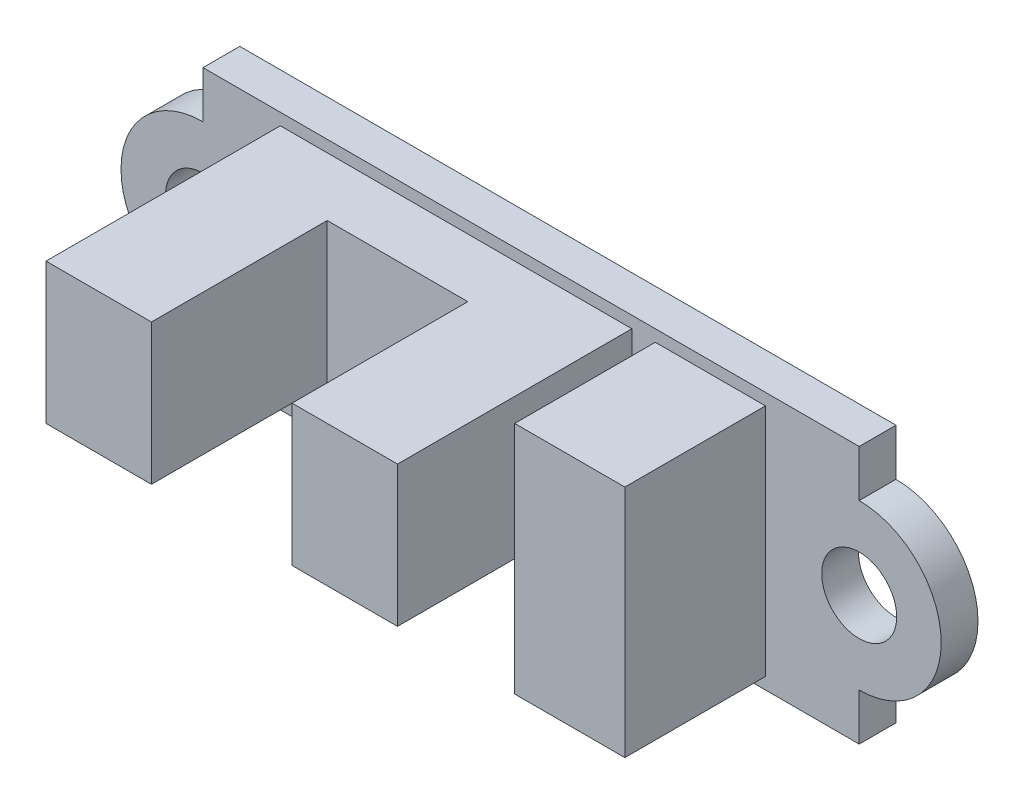
ISO-10303-21;
HEADER;
FILE_DESCRIPTION(('STEP AP214'),'2;1');
FILE_NAME('part.step','',(''),(''),'','','');
FILE_SCHEMA(('AUTOMOTIVE_DESIGN { 1 0 10303 214 1 1 1 1 }'));
ENDSEC;
DATA;
#1=APPLICATION_CONTEXT('core data for automotive mechanical design processes');
#2=APPLICATION_PROTOCOL_DEFINITION('international standard','automotive_design',2000,#1);
#3=PRODUCT_CONTEXT('',#1,'mechanical');
#4=PRODUCT('Part','Part','',(#3));
#5=PRODUCT_RELATED_PRODUCT_CATEGORY('part','',(#4));
#6=PRODUCT_DEFINITION_FORMATION('','',#4);
#7=PRODUCT_DEFINITION_CONTEXT('part definition',#1,'design');
#8=PRODUCT_DEFINITION('design','',#6,#7);
#9=PRODUCT_DEFINITION_SHAPE('','',#8);
#10=(LENGTH_UNIT() NAMED_UNIT(*) SI_UNIT(.MILLI.,.METRE.));
#11=(NAMED_UNIT(*) PLANE_ANGLE_UNIT() SI_UNIT($,.RADIAN.));
#12=(NAMED_UNIT(*) SI_UNIT($,.STERADIAN.) SOLID_ANGLE_UNIT());
#13=UNCERTAINTY_MEASURE_WITH_UNIT(LENGTH_MEASURE(1.E-05),#10,'distance_accuracy_value','');
#14=(GEOMETRIC_REPRESENTATION_CONTEXT(3) GLOBAL_UNCERTAINTY_ASSIGNED_CONTEXT((#13)) GLOBAL_UNIT_ASSIGNED_CONTEXT((#10,
#11,#12)) REPRESENTATION_CONTEXT('',''));
#15=CARTESIAN_POINT('',(0.,0.,0.));
#16=DIRECTION('',(0.,0.,1.));
#17=DIRECTION('',(1.,0.,0.));
#18=AXIS2_PLACEMENT_3D('',#15,#16,#17);
#19=CARTESIAN_POINT('',(0.,5.,2.5));
#20=DIRECTION('',(0.,0.999999999999999,0.));
#21=DIRECTION('',(0.,0.,1.));
#22=AXIS2_PLACEMENT_3D('',#19,#20,#21);
#23=PLANE('',#22);
#24=DIRECTION('',(0.999999999999999,0.,0.));
#25=VECTOR('',#24,1.);
#26=CARTESIAN_POINT('',(0.,5.,0.));
#27=LINE('',#26,#25);
#28=CARTESIAN_POINT('',(-10.6999999999998,4.99999999999984,0.));
#29=VERTEX_POINT('',#28);
#30=CARTESIAN_POINT('',(4.30000000000003,4.99999999999984,0.));
#31=VERTEX_POINT('',#30);
#32=EDGE_CURVE('E174',#29,#31,#27,.T.);
#33=ORIENTED_EDGE('',*,*,#32,.F.);
#34=DIRECTION('',(0.,0.,-1.));
#35=VECTOR('',#34,1.);
#36=CARTESIAN_POINT('',(-10.6999999999999,4.99999999999984,9.99999999999998));
#37=LINE('',#36,#35);
#38=CARTESIAN_POINT('',(-10.6999999999999,4.99999999999984,9.99999999999998));
#39=VERTEX_POINT('',#38);
#40=EDGE_CURVE('E163',#39,#29,#37,.T.);
#41=ORIENTED_EDGE('',*,*,#40,.F.);
#42=DIRECTION('',(0.999999999999999,0.,0.));
#43=VECTOR('',#42,1.);
#44=CARTESIAN_POINT('',(0.,4.99999999999984,10.));
#45=LINE('',#44,#43);
#46=CARTESIAN_POINT('',(-6.19999999999993,4.99999999999984,9.99999999999998));
#47=VERTEX_POINT('',#46);
#48=EDGE_CURVE('E160',#39,#47,#45,.T.);
#49=ORIENTED_EDGE('',*,*,#48,.T.);
#50=DIRECTION('',(0.,0.,-1.));
#51=VECTOR('',#50,1.);
#52=CARTESIAN_POINT('',(-6.19999999999993,4.99999999999984,9.99999999999998));
#53=LINE('',#52,#51);
#54=CARTESIAN_POINT('',(-6.19999999999998,5.,2.49999999999992));
#55=VERTEX_POINT('',#54);
#56=EDGE_CURVE('E168',#47,#55,#53,.T.);
#57=ORIENTED_EDGE('',*,*,#56,.T.);
#58=DIRECTION('',(0.999999999999999,0.,0.));
#59=VECTOR('',#58,1.);
#60=CARTESIAN_POINT('',(0.,5.,2.5));
#61=LINE('',#60,#59);
#62=CARTESIAN_POINT('',(-0.199999999999978,5.,2.5));
#63=VERTEX_POINT('',#62);
#64=EDGE_CURVE('E124',#55,#63,#61,.T.);
#65=ORIENTED_EDGE('',*,*,#64,.T.);
#66=DIRECTION('',(0.,0.,-1.));
#67=VECTOR('',#66,1.);
#68=CARTESIAN_POINT('',(-0.199999999999978,4.99999999999984,10.));
#69=LINE('',#68,#67);
#70=CARTESIAN_POINT('',(-0.199999999999978,4.99999999999984,10.));
#71=VERTEX_POINT('',#70);
#72=EDGE_CURVE('E117',#71,#63,#69,.T.);
#73=ORIENTED_EDGE('',*,*,#72,.F.);
#74=DIRECTION('',(0.999999999999999,0.,0.));
#75=VECTOR('',#74,1.);
#76=CARTESIAN_POINT('',(0.,4.99999999999984,10.));
#77=LINE('',#76,#75);
#78=CARTESIAN_POINT('',(4.30000000000003,4.99999999999967,9.99999999999998));
#79=VERTEX_POINT('',#78);
#80=EDGE_CURVE('E121',#71,#79,#77,.T.);
#81=ORIENTED_EDGE('',*,*,#80,.T.);
#82=DIRECTION('',(0.,0.,-1.));
#83=VECTOR('',#82,1.);
#84=CARTESIAN_POINT('',(4.30000000000003,4.99999999999967,9.99999999999998));
#85=LINE('',#84,#83);
#86=EDGE_CURVE('E146',#79,#31,#85,.T.);
#87=ORIENTED_EDGE('',*,*,#86,.T.);
#88=EDGE_LOOP('',(#33,#41,#49,#57,#65,#73,#81,#87));
#89=FACE_BOUND('',#88,.T.);
#90=ADVANCED_FACE('F50',(#89),#23,.T.);
#91=CARTESIAN_POINT('',(0.,-1.,2.5));
#92=DIRECTION('',(0.,0.999999999999999,0.));
#93=DIRECTION('',(0.,0.,1.));
#94=AXIS2_PLACEMENT_3D('',#91,#92,#93);
#95=PLANE('',#94);
#96=DIRECTION('',(0.999999999999999,0.,0.));
#97=VECTOR('',#96,1.);
#98=CARTESIAN_POINT('',(0.,-1.,0.));
#99=LINE('',#98,#97);
#100=CARTESIAN_POINT('',(-10.7,-1.00000000000017,0.));
#101=VERTEX_POINT('',#100);
#102=CARTESIAN_POINT('',(4.30000000000003,-1.00000000000017,0.));
#103=VERTEX_POINT('',#102);
#104=EDGE_CURVE('E53',#101,#103,#99,.T.);
#105=ORIENTED_EDGE('',*,*,#104,.T.);
#106=DIRECTION('',(0.,0.,-1.));
#107=VECTOR('',#106,1.);
#108=CARTESIAN_POINT('',(4.30000000000003,-1.00000000000033,9.99999999999998));
#109=LINE('',#108,#107);
#110=CARTESIAN_POINT('',(4.30000000000003,-1.00000000000033,9.99999999999998));
#111=VERTEX_POINT('',#110);
#112=EDGE_CURVE('E149',#111,#103,#109,.T.);
#113=ORIENTED_EDGE('',*,*,#112,.F.);
#114=DIRECTION('',(0.999999999999999,0.,0.));
#115=VECTOR('',#114,1.);
#116=CARTESIAN_POINT('',(0.,-1.00000000000017,10.));
#117=LINE('',#116,#115);
#118=CARTESIAN_POINT('',(-0.199999999999978,-1.00000000000017,10.));
#119=VERTEX_POINT('',#118);
#120=EDGE_CURVE('E135',#119,#111,#117,.T.);
#121=ORIENTED_EDGE('',*,*,#120,.F.);
#122=DIRECTION('',(0.,0.,-1.));
#123=VECTOR('',#122,1.);
#124=CARTESIAN_POINT('',(-0.199999999999978,-1.00000000000017,10.));
#125=LINE('',#124,#123);
#126=CARTESIAN_POINT('',(-0.199999999999978,-1.,2.5));
#127=VERTEX_POINT('',#126);
#128=EDGE_CURVE('E127',#119,#127,#125,.T.);
#129=ORIENTED_EDGE('',*,*,#128,.T.);
#130=DIRECTION('',(0.999999999999999,0.,0.));
#131=VECTOR('',#130,1.);
#132=CARTESIAN_POINT('',(0.,-1.,2.5));
#133=LINE('',#132,#131);
#134=CARTESIAN_POINT('',(-6.19999999999998,-1.,2.49999999999992));
#135=VERTEX_POINT('',#134);
#136=EDGE_CURVE('E12',#135,#127,#133,.T.);
#137=ORIENTED_EDGE('',*,*,#136,.F.);
#138=DIRECTION('',(0.,0.,-1.));
#139=VECTOR('',#138,1.);
#140=CARTESIAN_POINT('',(-6.19999999999998,-1.00000000000017,9.99999999999998));
#141=LINE('',#140,#139);
#142=CARTESIAN_POINT('',(-6.19999999999998,-1.00000000000017,9.99999999999998));
#143=VERTEX_POINT('',#142);
#144=EDGE_CURVE('E66',#143,#135,#141,.T.);
#145=ORIENTED_EDGE('',*,*,#144,.F.);
#146=DIRECTION('',(0.999999999999999,0.,0.));
#147=VECTOR('',#146,1.);
#148=CARTESIAN_POINT('',(0.,-1.00000000000017,10.));
#149=LINE('',#148,#147);
#150=CARTESIAN_POINT('',(-10.7,-1.00000000000017,9.99999999999998));
#151=VERTEX_POINT('',#150);
#152=EDGE_CURVE('E156',#151,#143,#149,.T.);
#153=ORIENTED_EDGE('',*,*,#152,.F.);
#154=DIRECTION('',(0.,0.,-1.));
#155=VECTOR('',#154,1.);
#156=CARTESIAN_POINT('',(-10.7,-1.00000000000017,9.99999999999998));
#157=LINE('',#156,#155);
#158=EDGE_CURVE('E171',#151,#101,#157,.T.);
#159=ORIENTED_EDGE('',*,*,#158,.T.);
#160=EDGE_LOOP('',(#105,#113,#121,#129,#137,#145,#153,#159));
#161=FACE_BOUND('',#160,.T.);
#162=ADVANCED_FACE('F181',(#161),#95,.F.);
#163=CARTESIAN_POINT('',(0.,0.,2.5));
#164=DIRECTION('',(0.,0.,1.));
#165=DIRECTION('',(0.999999999999999,0.,0.));
#166=AXIS2_PLACEMENT_3D('',#163,#164,#165);
#167=PLANE('',#166);
#168=DIRECTION('',(0.,-0.999999999999999,0.));
#169=VECTOR('',#168,1.);
#170=CARTESIAN_POINT('',(-0.199999999999978,0.,2.5));
#171=LINE('',#170,#169);
#172=EDGE_CURVE('E73',#63,#127,#171,.T.);
#173=ORIENTED_EDGE('',*,*,#172,.F.);
#174=ORIENTED_EDGE('',*,*,#64,.F.);
#175=DIRECTION('',(0.,-0.999999999999999,0.));
#176=VECTOR('',#175,1.);
#177=CARTESIAN_POINT('',(-6.19999999999984,0.,2.49999999999992));
#178=LINE('',#177,#176);
#179=EDGE_CURVE('E58',#55,#135,#178,.T.);
#180=ORIENTED_EDGE('',*,*,#179,.T.);
#181=ORIENTED_EDGE('',*,*,#136,.T.);
#182=EDGE_LOOP('',(#173,#174,#180,#181));
#183=FACE_BOUND('',#182,.T.);
#184=ADVANCED_FACE('F189',(#183),#167,.T.);
#185=CARTESIAN_POINT('',(0.,0.,0.));
#186=DIRECTION('',(0.,0.,1.));
#187=DIRECTION('',(0.999999999999999,0.,0.));
#188=AXIS2_PLACEMENT_3D('',#185,#186,#187);
#189=PLANE('',#188);
#190=ORIENTED_EDGE('',*,*,#32,.T.);
#191=DIRECTION('',(0.,-0.999999999999999,0.));
#192=VECTOR('',#191,1.);
#193=CARTESIAN_POINT('',(4.30000000000003,-1.66533453693773E-13,0.));
#194=LINE('',#193,#192);
#195=EDGE_CURVE('E140',#31,#103,#194,.T.);
#196=ORIENTED_EDGE('',*,*,#195,.T.);
#197=ORIENTED_EDGE('',*,*,#104,.F.);
#198=DIRECTION('',(0.,-0.999999999999999,0.));
#199=VECTOR('',#198,1.);
#200=CARTESIAN_POINT('',(-10.7,-1.66533453693773E-13,0.));
#201=LINE('',#200,#199);
#202=EDGE_CURVE('E126',#29,#101,#201,.T.);
#203=ORIENTED_EDGE('',*,*,#202,.F.);
#204=EDGE_LOOP('',(#190,#196,#197,#203));
#205=FACE_BOUND('',#204,.T.);
#206=ADVANCED_FACE('F186',(#205),#189,.F.);
#207=CARTESIAN_POINT('',(-6.19999999999998,-1.66533453693773E-13,9.99999999999998));
#208=DIRECTION('',(0.999999999999999,0.,0.));
#209=DIRECTION('',(0.,0.999999999999999,0.));
#210=AXIS2_PLACEMENT_3D('',#207,#208,#209);
#211=PLANE('',#210);
#212=ORIENTED_EDGE('',*,*,#179,.F.);
#213=ORIENTED_EDGE('',*,*,#56,.F.);
#214=DIRECTION('',(0.,-0.999999999999999,0.));
#215=VECTOR('',#214,1.);
#216=CARTESIAN_POINT('',(-6.19999999999998,-1.66533453693773E-13,9.99999999999998));
#217=LINE('',#216,#215);
#218=EDGE_CURVE('E158',#47,#143,#217,.T.);
#219=ORIENTED_EDGE('',*,*,#218,.T.);
#220=ORIENTED_EDGE('',*,*,#144,.T.);
#221=EDGE_LOOP('',(#212,#213,#219,#220));
#222=FACE_BOUND('',#221,.T.);
#223=ADVANCED_FACE('F188',(#222),#211,.T.);
#224=CARTESIAN_POINT('',(-10.7,-1.66533453693773E-13,9.99999999999998));
#225=DIRECTION('',(0.999999999999999,0.,0.));
#226=DIRECTION('',(0.,0.,-1.));
#227=AXIS2_PLACEMENT_3D('',#224,#225,#226);
#228=PLANE('',#227);
#229=ORIENTED_EDGE('',*,*,#202,.T.);
#230=ORIENTED_EDGE('',*,*,#158,.F.);
#231=DIRECTION('',(0.,-0.999999999999999,0.));
#232=VECTOR('',#231,1.);
#233=CARTESIAN_POINT('',(-10.7,-1.66533453693773E-13,9.99999999999998));
#234=LINE('',#233,#232);
#235=EDGE_CURVE('E153',#39,#151,#234,.T.);
#236=ORIENTED_EDGE('',*,*,#235,.F.);
#237=ORIENTED_EDGE('',*,*,#40,.T.);
#238=EDGE_LOOP('',(#229,#230,#236,#237));
#239=FACE_BOUND('',#238,.T.);
#240=ADVANCED_FACE('F195',(#239),#228,.F.);
#241=CARTESIAN_POINT('',(0.,-1.66533453693773E-13,10.));
#242=DIRECTION('',(0.,0.,1.));
#243=DIRECTION('',(0.999999999999999,0.,0.));
#244=AXIS2_PLACEMENT_3D('',#241,#242,#243);
#245=PLANE('',#244);
#246=ORIENTED_EDGE('',*,*,#235,.T.);
#247=ORIENTED_EDGE('',*,*,#152,.T.);
#248=ORIENTED_EDGE('',*,*,#218,.F.);
#249=ORIENTED_EDGE('',*,*,#48,.F.);
#250=EDGE_LOOP('',(#246,#247,#248,#249));
#251=FACE_BOUND('',#250,.T.);
#252=ADVANCED_FACE('F230',(#251),#245,.T.);
#253=CARTESIAN_POINT('',(-0.199999999999978,-1.66533453693773E-13,10.));
#254=DIRECTION('',(0.999999999999999,0.,0.));
#255=DIRECTION('',(0.,0.999999999999999,0.));
#256=AXIS2_PLACEMENT_3D('',#253,#254,#255);
#257=PLANE('',#256);
#258=ORIENTED_EDGE('',*,*,#72,.T.);
#259=ORIENTED_EDGE('',*,*,#172,.T.);
#260=ORIENTED_EDGE('',*,*,#128,.F.);
#261=DIRECTION('',(0.,-0.999999999999999,0.));
#262=VECTOR('',#261,1.);
#263=CARTESIAN_POINT('',(-0.199999999999978,-1.66533453693773E-13,10.));
#264=LINE('',#263,#262);
#265=EDGE_CURVE('E130',#71,#119,#264,.T.);
#266=ORIENTED_EDGE('',*,*,#265,.F.);
#267=EDGE_LOOP('',(#258,#259,#260,#266));
#268=FACE_BOUND('',#267,.T.);
#269=ADVANCED_FACE('F131',(#268),#257,.F.);
#270=CARTESIAN_POINT('',(4.30000000000003,-3.33066907387547E-13,9.99999999999998));
#271=DIRECTION('',(0.999999999999999,0.,0.));
#272=DIRECTION('',(0.,0.999999999999999,0.));
#273=AXIS2_PLACEMENT_3D('',#270,#271,#272);
#274=PLANE('',#273);
#275=ORIENTED_EDGE('',*,*,#195,.F.);
#276=ORIENTED_EDGE('',*,*,#86,.F.);
#277=DIRECTION('',(0.,-0.999999999999999,0.));
#278=VECTOR('',#277,1.);
#279=CARTESIAN_POINT('',(4.30000000000003,-3.33066907387547E-13,9.99999999999998));
#280=LINE('',#279,#278);
#281=EDGE_CURVE('E139',#79,#111,#280,.T.);
#282=ORIENTED_EDGE('',*,*,#281,.T.);
#283=ORIENTED_EDGE('',*,*,#112,.T.);
#284=EDGE_LOOP('',(#275,#276,#282,#283));
#285=FACE_BOUND('',#284,.T.);
#286=ADVANCED_FACE('F185',(#285),#274,.T.);
#287=CARTESIAN_POINT('',(0.,-1.66533453693773E-13,10.));
#288=DIRECTION('',(0.,0.,1.));
#289=DIRECTION('',(0.999999999999999,0.,0.));
#290=AXIS2_PLACEMENT_3D('',#287,#288,#289);
#291=PLANE('',#290);
#292=ORIENTED_EDGE('',*,*,#80,.F.);
#293=ORIENTED_EDGE('',*,*,#265,.T.);
#294=ORIENTED_EDGE('',*,*,#120,.T.);
#295=ORIENTED_EDGE('',*,*,#281,.F.);
#296=EDGE_LOOP('',(#292,#293,#294,#295));
#297=FACE_BOUND('',#296,.T.);
#298=ADVANCED_FACE('F137',(#297),#291,.T.);
#299=CLOSED_SHELL('',(#90,#162,#184,#206,#223,#240,#252,#269,#286,#298));
#300=MANIFOLD_SOLID_BREP('B2',#299);
#301=CARTESIAN_POINT('',(-14.,-1.66533453693773E-13,0.));
#302=DIRECTION('',(0.,0.,1.));
#303=DIRECTION('',(0.999999999999999,0.,0.));
#304=AXIS2_PLACEMENT_3D('',#301,#302,#303);
#305=PLANE('',#304);
#306=CARTESIAN_POINT('',(13.9999999999999,1.66533453693773E-13,0.));
#307=DIRECTION('',(0.,0.,1.));
#308=DIRECTION('',(0.999999999999999,0.,0.));
#309=AXIS2_PLACEMENT_3D('',#306,#307,#308);
#310=CIRCLE('',#309,1.6);
#311=CARTESIAN_POINT('',(15.5999999999999,1.65467639590133E-13,0.));
#312=VERTEX_POINT('',#311);
#313=EDGE_CURVE('E529',#312,#312,#310,.T.);
#314=ORIENTED_EDGE('',*,*,#313,.F.);
#315=EDGE_LOOP('',(#314));
#316=FACE_BOUND('',#315,.T.);
#317=CARTESIAN_POINT('',(-14.,-1.66533453693773E-13,0.));
#318=DIRECTION('',(0.,0.,1.));
#319=DIRECTION('',(0.999999999999999,0.,0.));
#320=AXIS2_PLACEMENT_3D('',#317,#318,#319);
#321=CIRCLE('',#320,1.6);
#322=CARTESIAN_POINT('',(-12.4,-1.67599267797414E-13,0.));
#323=VERTEX_POINT('',#322);
#324=EDGE_CURVE('E533',#323,#323,#321,.T.);
#325=ORIENTED_EDGE('',*,*,#324,.F.);
#326=EDGE_LOOP('',(#325));
#327=FACE_BOUND('',#326,.T.);
#328=DIRECTION('',(0.,0.999999999999999,0.));
#329=VECTOR('',#328,1.);
#330=CARTESIAN_POINT('',(13.9999999999999,3.50000000000017,0.));
#331=LINE('',#330,#329);
#332=CARTESIAN_POINT('',(13.9999999999999,3.50000000000017,0.));
#333=VERTEX_POINT('',#332);
#334=CARTESIAN_POINT('',(13.9999999999999,5.50000000000012,0.));
#335=VERTEX_POINT('',#334);
#336=EDGE_CURVE('E406',#333,#335,#331,.T.);
#337=ORIENTED_EDGE('',*,*,#336,.T.);
#338=DIRECTION('',(-0.999999999999999,0.,0.));
#339=VECTOR('',#338,1.);
#340=CARTESIAN_POINT('',(-14.,5.49999999999984,0.));
#341=LINE('',#340,#339);
#342=CARTESIAN_POINT('',(-14.,5.49999999999984,0.));
#343=VERTEX_POINT('',#342);
#344=EDGE_CURVE('E409',#335,#343,#341,.T.);
#345=ORIENTED_EDGE('',*,*,#344,.T.);
#346=DIRECTION('',(0.,-0.999999999999999,0.));
#347=VECTOR('',#346,1.);
#348=CARTESIAN_POINT('',(-14.,3.49999999999984,0.));
#349=LINE('',#348,#347);
#350=CARTESIAN_POINT('',(-14.,3.49999999999984,0.));
#351=VERTEX_POINT('',#350);
#352=EDGE_CURVE('E413',#343,#351,#349,.T.);
#353=ORIENTED_EDGE('',*,*,#352,.T.);
#354=CARTESIAN_POINT('',(-14.,-1.66533453693773E-13,0.));
#355=DIRECTION('',(0.,0.,1.));
#356=DIRECTION('',(0.999999999999999,0.,0.));
#357=AXIS2_PLACEMENT_3D('',#354,#355,#356);
#358=CIRCLE('',#357,3.5);
#359=CARTESIAN_POINT('',(-13.9999999999998,-3.50000000000011,0.));
#360=VERTEX_POINT('',#359);
#361=EDGE_CURVE('E416',#351,#360,#358,.T.);
#362=ORIENTED_EDGE('',*,*,#361,.T.);
#363=DIRECTION('',(0.,-0.999999999999999,0.));
#364=VECTOR('',#363,1.);
#365=CARTESIAN_POINT('',(-13.9999999999998,-5.50000000000012,0.));
#366=LINE('',#365,#364);
#367=CARTESIAN_POINT('',(-13.9999999999998,-5.50000000000012,0.));
#368=VERTEX_POINT('',#367);
#369=EDGE_CURVE('E419',#360,#368,#366,.T.);
#370=ORIENTED_EDGE('',*,*,#369,.T.);
#371=DIRECTION('',(0.999999999999999,0.,0.));
#372=VECTOR('',#371,1.);
#373=CARTESIAN_POINT('',(-13.9999999999998,-5.50000000000012,0.));
#374=LINE('',#373,#372);
#375=CARTESIAN_POINT('',(13.9999999999999,-5.49999999999984,0.));
#376=VERTEX_POINT('',#375);
#377=EDGE_CURVE('E422',#368,#376,#374,.T.);
#378=ORIENTED_EDGE('',*,*,#377,.T.);
#379=DIRECTION('',(0.,0.999999999999999,0.));
#380=VECTOR('',#379,1.);
#381=CARTESIAN_POINT('',(13.9999999999999,-5.49999999999984,0.));
#382=LINE('',#381,#380);
#383=CARTESIAN_POINT('',(14.,-3.49999999999984,0.));
#384=VERTEX_POINT('',#383);
#385=EDGE_CURVE('E383',#376,#384,#382,.T.);
#386=ORIENTED_EDGE('',*,*,#385,.T.);
#387=CARTESIAN_POINT('',(13.9999999999999,1.66533453693773E-13,0.));
#388=DIRECTION('',(0.,0.,1.));
#389=DIRECTION('',(0.999999999999999,0.,0.));
#390=AXIS2_PLACEMENT_3D('',#387,#388,#389);
#391=CIRCLE('',#390,3.5);
#392=EDGE_CURVE('E425',#384,#333,#391,.T.);
#393=ORIENTED_EDGE('',*,*,#392,.T.);
#394=EDGE_LOOP('',(#337,#345,#353,#362,#370,#378,#386,#393));
#395=FACE_BOUND('',#394,.T.);
#396=DIRECTION('',(0.999999999999999,0.,0.));
#397=VECTOR('',#396,1.);
#398=CARTESIAN_POINT('',(0.,5.,0.));
#399=LINE('',#398,#397);
#400=CARTESIAN_POINT('',(5.29999999999997,4.99999999999984,0.));
#401=VERTEX_POINT('',#400);
#402=CARTESIAN_POINT('',(9.99999999999993,5.,0.));
#403=VERTEX_POINT('',#402);
#404=EDGE_CURVE('E516',#401,#403,#399,.T.);
#405=ORIENTED_EDGE('',*,*,#404,.T.);
#406=DIRECTION('',(0.,-0.999999999999999,0.));
#407=VECTOR('',#406,1.);
#408=CARTESIAN_POINT('',(9.99999999999993,0.,0.));
#409=LINE('',#408,#407);
#410=CARTESIAN_POINT('',(9.99999999999998,-4.99999999999995,0.));
#411=VERTEX_POINT('',#410);
#412=EDGE_CURVE('E312',#403,#411,#409,.T.);
#413=ORIENTED_EDGE('',*,*,#412,.T.);
#414=DIRECTION('',(0.999999999999999,0.,0.));
#415=VECTOR('',#414,1.);
#416=CARTESIAN_POINT('',(1.66533453693773E-13,-5.,0.));
#417=LINE('',#416,#415);
#418=CARTESIAN_POINT('',(5.30000000000003,-5.00000000000017,0.));
#419=VERTEX_POINT('',#418);
#420=EDGE_CURVE('E500',#419,#411,#417,.T.);
#421=ORIENTED_EDGE('',*,*,#420,.F.);
#422=DIRECTION('',(0.,-0.999999999999999,0.));
#423=VECTOR('',#422,1.);
#424=CARTESIAN_POINT('',(5.29999999999997,-1.66533453693773E-13,0.));
#425=LINE('',#424,#423);
#426=EDGE_CURVE('E518',#401,#419,#425,.T.);
#427=ORIENTED_EDGE('',*,*,#426,.F.);
#428=EDGE_LOOP('',(#405,#413,#421,#427));
#429=FACE_BOUND('',#428,.T.);
#430=ADVANCED_FACE('F295',(#316,#327,#395,#429),#305,.T.);
#431=CARTESIAN_POINT('',(13.9999999999999,3.50000000000017,-1.57000000000008));
#432=DIRECTION('',(0.999999999999999,0.,0.));
#433=DIRECTION('',(0.,0.,-1.));
#434=AXIS2_PLACEMENT_3D('',#431,#432,#433);
#435=PLANE('',#434);
#436=ORIENTED_EDGE('',*,*,#336,.F.);
#437=DIRECTION('',(0.,0.,1.));
#438=VECTOR('',#437,1.);
#439=CARTESIAN_POINT('',(13.9999999999999,3.50000000000017,-1.57000000000008));
#440=LINE('',#439,#438);
#441=CARTESIAN_POINT('',(13.9999999999999,3.50000000000017,-1.57000000000008));
#442=VERTEX_POINT('',#441);
#443=EDGE_CURVE('E48',#442,#333,#440,.T.);
#444=ORIENTED_EDGE('',*,*,#443,.F.);
#445=DIRECTION('',(0.,0.999999999999999,0.));
#446=VECTOR('',#445,1.);
#447=CARTESIAN_POINT('',(13.9999999999999,3.50000000000017,-1.57000000000008));
#448=LINE('',#447,#446);
#449=CARTESIAN_POINT('',(13.9999999999999,5.50000000000012,-1.57000000000008));
#450=VERTEX_POINT('',#449);
#451=EDGE_CURVE('E427',#442,#450,#448,.T.);
#452=ORIENTED_EDGE('',*,*,#451,.T.);
#453=DIRECTION('',(0.,0.,1.));
#454=VECTOR('',#453,1.);
#455=CARTESIAN_POINT('',(13.9999999999999,5.50000000000012,-1.57000000000008));
#456=LINE('',#455,#454);
#457=EDGE_CURVE('E299',#450,#335,#456,.T.);
#458=ORIENTED_EDGE('',*,*,#457,.T.);
#459=EDGE_LOOP('',(#436,#444,#452,#458));
#460=FACE_BOUND('',#459,.T.);
#461=ADVANCED_FACE('F297',(#460),#435,.T.);
#462=CARTESIAN_POINT('',(14.,1.66533453693773E-13,-1.57000000000008));
#463=DIRECTION('',(0.,0.,1.));
#464=DIRECTION('',(0.999999999999999,0.,0.));
#465=AXIS2_PLACEMENT_3D('',#462,#463,#464);
#466=CYLINDRICAL_SURFACE('',#465,3.5);
#467=ORIENTED_EDGE('',*,*,#392,.F.);
#468=DIRECTION('',(0.,0.,1.));
#469=VECTOR('',#468,1.);
#470=CARTESIAN_POINT('',(13.9999999999999,-3.49999999999984,-1.57000000000008));
#471=LINE('',#470,#469);
#472=CARTESIAN_POINT('',(13.9999999999999,-3.49999999999984,-1.57000000000008));
#473=VERTEX_POINT('',#472);
#474=EDGE_CURVE('E304',#473,#384,#471,.T.);
#475=ORIENTED_EDGE('',*,*,#474,.F.);
#476=CARTESIAN_POINT('',(14.,1.66533453693773E-13,-1.57000000000008));
#477=DIRECTION('',(0.,0.,1.));
#478=DIRECTION('',(0.999999999999999,0.,0.));
#479=AXIS2_PLACEMENT_3D('',#476,#477,#478);
#480=CIRCLE('',#479,3.5);
#481=EDGE_CURVE('E396',#473,#442,#480,.T.);
#482=ORIENTED_EDGE('',*,*,#481,.T.);
#483=ORIENTED_EDGE('',*,*,#443,.T.);
#484=EDGE_LOOP('',(#467,#475,#482,#483));
#485=FACE_BOUND('',#484,.T.);
#486=ADVANCED_FACE('F439',(#485),#466,.T.);
#487=CARTESIAN_POINT('',(13.9999999999999,-5.49999999999984,-1.57000000000008));
#488=DIRECTION('',(0.999999999999999,0.,0.));
#489=DIRECTION('',(0.,0.,-1.));
#490=AXIS2_PLACEMENT_3D('',#487,#488,#489);
#491=PLANE('',#490);
#492=ORIENTED_EDGE('',*,*,#385,.F.);
#493=DIRECTION('',(0.,0.,1.));
#494=VECTOR('',#493,1.);
#495=CARTESIAN_POINT('',(13.9999999999999,-5.49999999999984,-1.57000000000008));
#496=LINE('',#495,#494);
#497=CARTESIAN_POINT('',(13.9999999999999,-5.49999999999984,-1.57000000000008));
#498=VERTEX_POINT('',#497);
#499=EDGE_CURVE('E377',#498,#376,#496,.T.);
#500=ORIENTED_EDGE('',*,*,#499,.F.);
#501=DIRECTION('',(0.,0.999999999999999,0.));
#502=VECTOR('',#501,1.);
#503=CARTESIAN_POINT('',(13.9999999999999,-5.49999999999984,-1.57000000000008));
#504=LINE('',#503,#502);
#505=EDGE_CURVE('E380',#498,#473,#504,.T.);
#506=ORIENTED_EDGE('',*,*,#505,.T.);
#507=ORIENTED_EDGE('',*,*,#474,.T.);
#508=EDGE_LOOP('',(#492,#500,#506,#507));
#509=FACE_BOUND('',#508,.T.);
#510=ADVANCED_FACE('F379',(#509),#491,.T.);
#511=CARTESIAN_POINT('',(-14.,-5.50000000000012,-1.57000000000007));
#512=DIRECTION('',(0.,-0.999999999999999,0.));
#513=DIRECTION('',(0.999999999999999,0.,0.));
#514=AXIS2_PLACEMENT_3D('',#511,#512,#513);
#515=PLANE('',#514);
#516=ORIENTED_EDGE('',*,*,#377,.F.);
#517=DIRECTION('',(0.,0.,1.));
#518=VECTOR('',#517,1.);
#519=CARTESIAN_POINT('',(-14.,-5.50000000000012,-1.57000000000007));
#520=LINE('',#519,#518);
#521=CARTESIAN_POINT('',(-14.,-5.50000000000012,-1.57000000000007));
#522=VERTEX_POINT('',#521);
#523=EDGE_CURVE('E388',#522,#368,#520,.T.);
#524=ORIENTED_EDGE('',*,*,#523,.F.);
#525=DIRECTION('',(0.999999999999999,0.,0.));
#526=VECTOR('',#525,1.);
#527=CARTESIAN_POINT('',(-14.,-5.50000000000012,-1.57000000000007));
#528=LINE('',#527,#526);
#529=EDGE_CURVE('E394',#522,#498,#528,.T.);
#530=ORIENTED_EDGE('',*,*,#529,.T.);
#531=ORIENTED_EDGE('',*,*,#499,.T.);
#532=EDGE_LOOP('',(#516,#524,#530,#531));
#533=FACE_BOUND('',#532,.T.);
#534=ADVANCED_FACE('F398',(#533),#515,.T.);
#535=CARTESIAN_POINT('',(-14.,-5.50000000000012,-1.57000000000007));
#536=DIRECTION('',(-0.999999999999999,0.,0.));
#537=DIRECTION('',(0.,-0.999999999999999,0.));
#538=AXIS2_PLACEMENT_3D('',#535,#536,#537);
#539=PLANE('',#538);
#540=ORIENTED_EDGE('',*,*,#369,.F.);
#541=DIRECTION('',(0.,0.,1.));
#542=VECTOR('',#541,1.);
#543=CARTESIAN_POINT('',(-14.,-3.50000000000011,-1.57000000000007));
#544=LINE('',#543,#542);
#545=CARTESIAN_POINT('',(-14.,-3.50000000000011,-1.57000000000007));
#546=VERTEX_POINT('',#545);
#547=EDGE_CURVE('E431',#546,#360,#544,.T.);
#548=ORIENTED_EDGE('',*,*,#547,.F.);
#549=DIRECTION('',(0.,-0.999999999999999,0.));
#550=VECTOR('',#549,1.);
#551=CARTESIAN_POINT('',(-14.,-5.50000000000012,-1.57000000000007));
#552=LINE('',#551,#550);
#553=EDGE_CURVE('E399',#546,#522,#552,.T.);
#554=ORIENTED_EDGE('',*,*,#553,.T.);
#555=ORIENTED_EDGE('',*,*,#523,.T.);
#556=EDGE_LOOP('',(#540,#548,#554,#555));
#557=FACE_BOUND('',#556,.T.);
#558=ADVANCED_FACE('F555',(#557),#539,.T.);
#559=CARTESIAN_POINT('',(-13.9999999999999,-1.66533453693773E-13,-1.57000000000007));
#560=DIRECTION('',(0.,0.,1.));
#561=DIRECTION('',(0.999999999999999,0.,0.));
#562=AXIS2_PLACEMENT_3D('',#559,#560,#561);
#563=CYLINDRICAL_SURFACE('',#562,3.5);
#564=ORIENTED_EDGE('',*,*,#361,.F.);
#565=DIRECTION('',(0.,0.,1.));
#566=VECTOR('',#565,1.);
#567=CARTESIAN_POINT('',(-14.,3.49999999999984,-1.57000000000007));
#568=LINE('',#567,#566);
#569=CARTESIAN_POINT('',(-14.,3.49999999999984,-1.57000000000007));
#570=VERTEX_POINT('',#569);
#571=EDGE_CURVE('E433',#570,#351,#568,.T.);
#572=ORIENTED_EDGE('',*,*,#571,.F.);
#573=CARTESIAN_POINT('',(-13.9999999999999,-1.66533453693773E-13,-1.57000000000007));
#574=DIRECTION('',(0.,0.,1.));
#575=DIRECTION('',(0.999999999999999,0.,0.));
#576=AXIS2_PLACEMENT_3D('',#573,#574,#575);
#577=CIRCLE('',#576,3.5);
#578=EDGE_CURVE('E401',#570,#546,#577,.T.);
#579=ORIENTED_EDGE('',*,*,#578,.T.);
#580=ORIENTED_EDGE('',*,*,#547,.T.);
#581=EDGE_LOOP('',(#564,#572,#579,#580));
#582=FACE_BOUND('',#581,.T.);
#583=ADVANCED_FACE('F549',(#582),#563,.T.);
#584=CARTESIAN_POINT('',(-14.,3.49999999999984,-1.57000000000007));
#585=DIRECTION('',(-0.999999999999999,0.,0.));
#586=DIRECTION('',(0.,-0.999999999999999,0.));
#587=AXIS2_PLACEMENT_3D('',#584,#585,#586);
#588=PLANE('',#587);
#589=ORIENTED_EDGE('',*,*,#352,.F.);
#590=DIRECTION('',(0.,0.,1.));
#591=VECTOR('',#590,1.);
#592=CARTESIAN_POINT('',(-14.,5.49999999999984,-1.57000000000007));
#593=LINE('',#592,#591);
#594=CARTESIAN_POINT('',(-14.,5.49999999999984,-1.57000000000007));
#595=VERTEX_POINT('',#594);
#596=EDGE_CURVE('E434',#595,#343,#593,.T.);
#597=ORIENTED_EDGE('',*,*,#596,.F.);
#598=DIRECTION('',(0.,-0.999999999999999,0.));
#599=VECTOR('',#598,1.);
#600=CARTESIAN_POINT('',(-14.,3.49999999999984,-1.57000000000007));
#601=LINE('',#600,#599);
#602=EDGE_CURVE('E543',#595,#570,#601,.T.);
#603=ORIENTED_EDGE('',*,*,#602,.T.);
#604=ORIENTED_EDGE('',*,*,#571,.T.);
#605=EDGE_LOOP('',(#589,#597,#603,#604));
#606=FACE_BOUND('',#605,.T.);
#607=ADVANCED_FACE('F553',(#606),#588,.T.);
#608=CARTESIAN_POINT('',(-14.,5.49999999999984,-1.57000000000007));
#609=DIRECTION('',(0.,0.999999999999999,0.));
#610=DIRECTION('',(0.,0.,1.));
#611=AXIS2_PLACEMENT_3D('',#608,#609,#610);
#612=PLANE('',#611);
#613=ORIENTED_EDGE('',*,*,#344,.F.);
#614=ORIENTED_EDGE('',*,*,#457,.F.);
#615=DIRECTION('',(-0.999999999999999,0.,0.));
#616=VECTOR('',#615,1.);
#617=CARTESIAN_POINT('',(-14.,5.49999999999984,-1.57000000000007));
#618=LINE('',#617,#616);
#619=EDGE_CURVE('E541',#450,#595,#618,.T.);
#620=ORIENTED_EDGE('',*,*,#619,.T.);
#621=ORIENTED_EDGE('',*,*,#596,.T.);
#622=EDGE_LOOP('',(#613,#614,#620,#621));
#623=FACE_BOUND('',#622,.T.);
#624=ADVANCED_FACE('F436',(#623),#612,.T.);
#625=CARTESIAN_POINT('',(-13.9999999999999,-1.66533453693773E-13,-1.57000000000007));
#626=DIRECTION('',(0.,0.,1.));
#627=DIRECTION('',(0.999999999999999,0.,0.));
#628=AXIS2_PLACEMENT_3D('',#625,#626,#627);
#629=PLANE('',#628);
#630=CARTESIAN_POINT('',(14.,1.66533453693773E-13,-1.57000000000008));
#631=DIRECTION('',(0.,0.,1.));
#632=DIRECTION('',(0.999999999999999,0.,0.));
#633=AXIS2_PLACEMENT_3D('',#630,#631,#632);
#634=CIRCLE('',#633,1.6);
#635=CARTESIAN_POINT('',(15.6,1.65467639590133E-13,-1.57000000000008));
#636=VERTEX_POINT('',#635);
#637=EDGE_CURVE('E530',#636,#636,#634,.T.);
#638=ORIENTED_EDGE('',*,*,#637,.T.);
#639=EDGE_LOOP('',(#638));
#640=FACE_BOUND('',#639,.T.);
#641=CARTESIAN_POINT('',(-13.9999999999999,-1.66533453693773E-13,-1.57000000000007));
#642=DIRECTION('',(0.,0.,1.));
#643=DIRECTION('',(0.999999999999999,0.,0.));
#644=AXIS2_PLACEMENT_3D('',#641,#642,#643);
#645=CIRCLE('',#644,1.6);
#646=CARTESIAN_POINT('',(-12.3999999999999,-1.67599267797414E-13,-1.57000000000007));
#647=VERTEX_POINT('',#646);
#648=EDGE_CURVE('E410',#647,#647,#645,.T.);
#649=ORIENTED_EDGE('',*,*,#648,.T.);
#650=EDGE_LOOP('',(#649));
#651=FACE_BOUND('',#650,.T.);
#652=ORIENTED_EDGE('',*,*,#451,.F.);
#653=ORIENTED_EDGE('',*,*,#481,.F.);
#654=ORIENTED_EDGE('',*,*,#505,.F.);
#655=ORIENTED_EDGE('',*,*,#529,.F.);
#656=ORIENTED_EDGE('',*,*,#553,.F.);
#657=ORIENTED_EDGE('',*,*,#578,.F.);
#658=ORIENTED_EDGE('',*,*,#602,.F.);
#659=ORIENTED_EDGE('',*,*,#619,.F.);
#660=EDGE_LOOP('',(#652,#653,#654,#655,#656,#657,#658,#659));
#661=FACE_BOUND('',#660,.T.);
#662=ADVANCED_FACE('F392',(#640,#651,#661),#629,.F.);
#663=CARTESIAN_POINT('',(-13.9999999999999,-1.66533453693773E-13,-1.57000000000007));
#664=DIRECTION('',(0.,0.,1.));
#665=DIRECTION('',(0.999999999999999,0.,0.));
#666=AXIS2_PLACEMENT_3D('',#663,#664,#665);
#667=CYLINDRICAL_SURFACE('',#666,1.6);
#668=ORIENTED_EDGE('',*,*,#648,.F.);
#669=EDGE_LOOP('',(#668));
#670=FACE_BOUND('',#669,.T.);
#671=ORIENTED_EDGE('',*,*,#324,.T.);
#672=EDGE_LOOP('',(#671));
#673=FACE_BOUND('',#672,.T.);
#674=ADVANCED_FACE('F457',(#670,#673),#667,.F.);
#675=CARTESIAN_POINT('',(14.,1.66533453693773E-13,-1.57000000000008));
#676=DIRECTION('',(0.,0.,1.));
#677=DIRECTION('',(0.999999999999999,0.,0.));
#678=AXIS2_PLACEMENT_3D('',#675,#676,#677);
#679=CYLINDRICAL_SURFACE('',#678,1.6);
#680=ORIENTED_EDGE('',*,*,#637,.F.);
#681=EDGE_LOOP('',(#680));
#682=FACE_BOUND('',#681,.T.);
#683=ORIENTED_EDGE('',*,*,#313,.T.);
#684=EDGE_LOOP('',(#683));
#685=FACE_BOUND('',#684,.T.);
#686=ADVANCED_FACE('F461',(#682,#685),#679,.F.);
#687=CARTESIAN_POINT('',(9.99999999999998,1.66533453693773E-13,6.));
#688=DIRECTION('',(0.999999999999999,0.,0.));
#689=DIRECTION('',(0.,0.,-1.));
#690=AXIS2_PLACEMENT_3D('',#687,#688,#689);
#691=PLANE('',#690);
#692=ORIENTED_EDGE('',*,*,#412,.F.);
#693=DIRECTION('',(0.,0.,-1.));
#694=VECTOR('',#693,1.);
#695=CARTESIAN_POINT('',(9.99999999999993,5.00000000000017,6.));
#696=LINE('',#695,#694);
#697=CARTESIAN_POINT('',(9.99999999999993,5.00000000000017,6.));
#698=VERTEX_POINT('',#697);
#699=EDGE_CURVE('E504',#698,#403,#696,.T.);
#700=ORIENTED_EDGE('',*,*,#699,.F.);
#701=DIRECTION('',(0.,-0.999999999999999,0.));
#702=VECTOR('',#701,1.);
#703=CARTESIAN_POINT('',(9.99999999999998,1.66533453693773E-13,6.));
#704=LINE('',#703,#702);
#705=CARTESIAN_POINT('',(9.99999999999993,-4.99999999999984,6.));
#706=VERTEX_POINT('',#705);
#707=EDGE_CURVE('E491',#698,#706,#704,.T.);
#708=ORIENTED_EDGE('',*,*,#707,.T.);
#709=DIRECTION('',(0.,0.,-1.));
#710=VECTOR('',#709,1.);
#711=CARTESIAN_POINT('',(9.99999999999993,-4.99999999999984,6.));
#712=LINE('',#711,#710);
#713=EDGE_CURVE('E514',#706,#411,#712,.T.);
#714=ORIENTED_EDGE('',*,*,#713,.T.);
#715=EDGE_LOOP('',(#692,#700,#708,#714));
#716=FACE_BOUND('',#715,.T.);
#717=ADVANCED_FACE('F465',(#716),#691,.T.);
#718=CARTESIAN_POINT('',(0.,5.,6.));
#719=DIRECTION('',(0.,0.999999999999999,0.));
#720=DIRECTION('',(-0.999999999999999,0.,0.));
#721=AXIS2_PLACEMENT_3D('',#718,#719,#720);
#722=PLANE('',#721);
#723=ORIENTED_EDGE('',*,*,#404,.F.);
#724=DIRECTION('',(0.,0.,-1.));
#725=VECTOR('',#724,1.);
#726=CARTESIAN_POINT('',(5.30000000000003,4.99999999999984,5.99999999999992));
#727=LINE('',#726,#725);
#728=CARTESIAN_POINT('',(5.30000000000003,4.99999999999984,5.99999999999992));
#729=VERTEX_POINT('',#728);
#730=EDGE_CURVE('E507',#729,#401,#727,.T.);
#731=ORIENTED_EDGE('',*,*,#730,.F.);
#732=DIRECTION('',(0.999999999999999,0.,0.));
#733=VECTOR('',#732,1.);
#734=CARTESIAN_POINT('',(0.,5.,6.));
#735=LINE('',#734,#733);
#736=EDGE_CURVE('E495',#729,#698,#735,.T.);
#737=ORIENTED_EDGE('',*,*,#736,.T.);
#738=ORIENTED_EDGE('',*,*,#699,.T.);
#739=EDGE_LOOP('',(#723,#731,#737,#738));
#740=FACE_BOUND('',#739,.T.);
#741=ADVANCED_FACE('F469',(#740),#722,.T.);
#742=CARTESIAN_POINT('',(5.30000000000014,-1.66533453693773E-13,5.99999999999992));
#743=DIRECTION('',(0.999999999999999,0.,0.));
#744=DIRECTION('',(0.,0.999999999999999,0.));
#745=AXIS2_PLACEMENT_3D('',#742,#743,#744);
#746=PLANE('',#745);
#747=ORIENTED_EDGE('',*,*,#426,.T.);
#748=DIRECTION('',(0.,0.,-1.));
#749=VECTOR('',#748,1.);
#750=CARTESIAN_POINT('',(5.30000000000003,-5.00000000000017,5.99999999999992));
#751=LINE('',#750,#749);
#752=CARTESIAN_POINT('',(5.30000000000003,-5.00000000000017,5.99999999999992));
#753=VERTEX_POINT('',#752);
#754=EDGE_CURVE('E524',#753,#419,#751,.T.);
#755=ORIENTED_EDGE('',*,*,#754,.F.);
#756=DIRECTION('',(0.,-0.999999999999999,0.));
#757=VECTOR('',#756,1.);
#758=CARTESIAN_POINT('',(5.30000000000014,-1.66533453693773E-13,5.99999999999992));
#759=LINE('',#758,#757);
#760=EDGE_CURVE('E509',#729,#753,#759,.T.);
#761=ORIENTED_EDGE('',*,*,#760,.F.);
#762=ORIENTED_EDGE('',*,*,#730,.T.);
#763=EDGE_LOOP('',(#747,#755,#761,#762));
#764=FACE_BOUND('',#763,.T.);
#765=ADVANCED_FACE('F472',(#764),#746,.F.);
#766=CARTESIAN_POINT('',(0.,-5.,6.));
#767=DIRECTION('',(0.,0.999999999999999,0.));
#768=DIRECTION('',(0.,0.,1.));
#769=AXIS2_PLACEMENT_3D('',#766,#767,#768);
#770=PLANE('',#769);
#771=ORIENTED_EDGE('',*,*,#420,.T.);
#772=ORIENTED_EDGE('',*,*,#713,.F.);
#773=DIRECTION('',(0.999999999999999,0.,0.));
#774=VECTOR('',#773,1.);
#775=CARTESIAN_POINT('',(0.,-5.,6.));
#776=LINE('',#775,#774);
#777=EDGE_CURVE('E497',#753,#706,#776,.T.);
#778=ORIENTED_EDGE('',*,*,#777,.F.);
#779=ORIENTED_EDGE('',*,*,#754,.T.);
#780=EDGE_LOOP('',(#771,#772,#778,#779));
#781=FACE_BOUND('',#780,.T.);
#782=ADVANCED_FACE('F476',(#781),#770,.F.);
#783=CARTESIAN_POINT('',(1.66533453693773E-13,0.,6.));
#784=DIRECTION('',(0.,0.,1.));
#785=DIRECTION('',(0.999999999999999,0.,0.));
#786=AXIS2_PLACEMENT_3D('',#783,#784,#785);
#787=PLANE('',#786);
#788=ORIENTED_EDGE('',*,*,#707,.F.);
#789=ORIENTED_EDGE('',*,*,#736,.F.);
#790=ORIENTED_EDGE('',*,*,#760,.T.);
#791=ORIENTED_EDGE('',*,*,#777,.T.);
#792=EDGE_LOOP('',(#788,#789,#790,#791));
#793=FACE_BOUND('',#792,.T.);
#794=ADVANCED_FACE('F480',(#793),#787,.T.);
#795=CLOSED_SHELL('',(#430,#461,#486,#510,#534,#558,#583,#607,#624,#662,#674,#686,#717,#741,
#765,#782,#794));
#796=MANIFOLD_SOLID_BREP('B6',#795);
#797=ADVANCED_BREP_SHAPE_REPRESENTATION('',(#18,#300,#796),#14);
#798=SHAPE_DEFINITION_REPRESENTATION(#9,#797);
ENDSEC;
END-ISO-10303-21;
